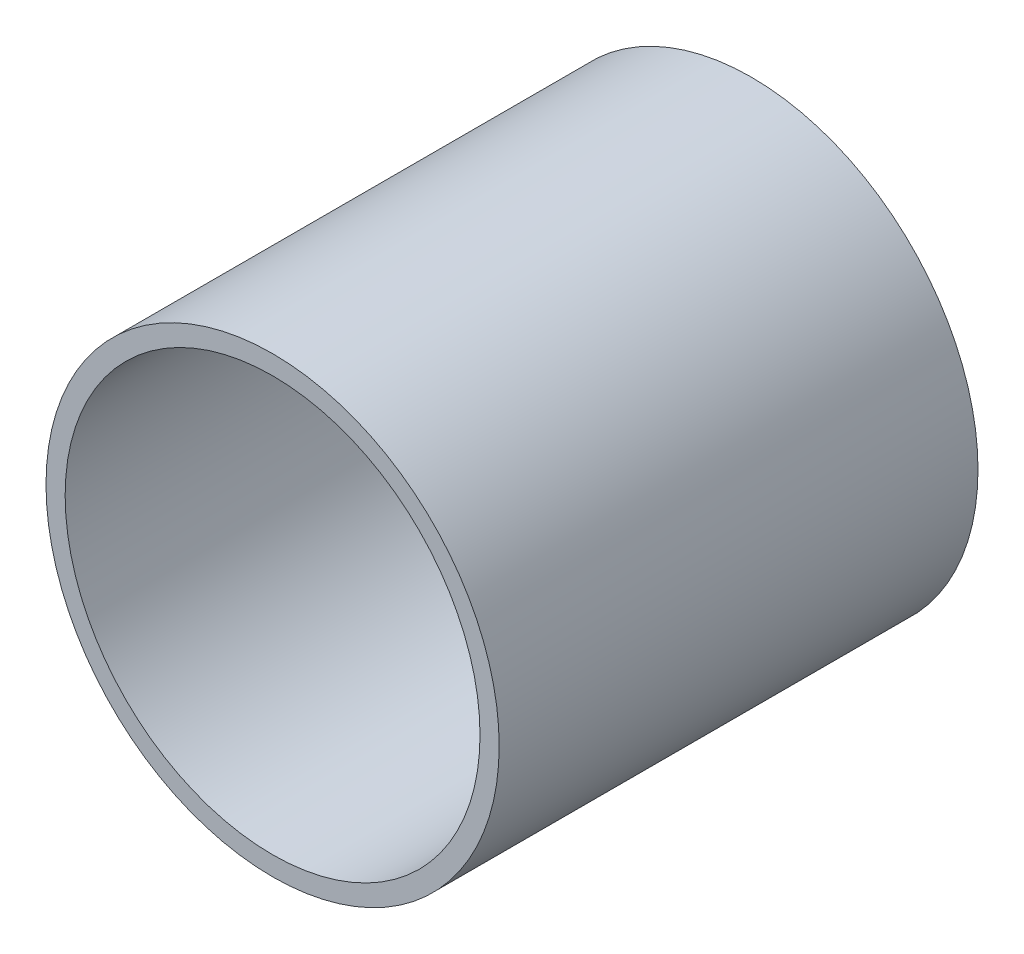
ISO-10303-21;
HEADER;
FILE_DESCRIPTION(('STEP AP214'),'2;1');
FILE_NAME('part.step','',(''),(''),'','','');
FILE_SCHEMA(('AUTOMOTIVE_DESIGN { 1 0 10303 214 1 1 1 1 }'));
ENDSEC;
DATA;
#1=APPLICATION_CONTEXT('core data for automotive mechanical design processes');
#2=APPLICATION_PROTOCOL_DEFINITION('international standard','automotive_design',2000,#1);
#3=PRODUCT_CONTEXT('',#1,'mechanical');
#4=PRODUCT('Part','Part','',(#3));
#5=PRODUCT_RELATED_PRODUCT_CATEGORY('part','',(#4));
#6=PRODUCT_DEFINITION_FORMATION('','',#4);
#7=PRODUCT_DEFINITION_CONTEXT('part definition',#1,'design');
#8=PRODUCT_DEFINITION('design','',#6,#7);
#9=PRODUCT_DEFINITION_SHAPE('','',#8);
#10=(LENGTH_UNIT() NAMED_UNIT(*) SI_UNIT(.MILLI.,.METRE.));
#11=(NAMED_UNIT(*) PLANE_ANGLE_UNIT() SI_UNIT($,.RADIAN.));
#12=(NAMED_UNIT(*) SI_UNIT($,.STERADIAN.) SOLID_ANGLE_UNIT());
#13=UNCERTAINTY_MEASURE_WITH_UNIT(LENGTH_MEASURE(1.E-05),#10,'distance_accuracy_value','');
#14=(GEOMETRIC_REPRESENTATION_CONTEXT(3) GLOBAL_UNCERTAINTY_ASSIGNED_CONTEXT((#13)) GLOBAL_UNIT_ASSIGNED_CONTEXT((#10,
#11,#12)) REPRESENTATION_CONTEXT('',''));
#15=CARTESIAN_POINT('',(0.,0.,0.));
#16=DIRECTION('',(0.,0.,1.));
#17=DIRECTION('',(1.,0.,0.));
#18=AXIS2_PLACEMENT_3D('',#15,#16,#17);
#19=CARTESIAN_POINT('',(-18.5837325396855,1.91004791513109,97.4087240167017));
#20=DIRECTION('',(0.,0.,1.));
#21=DIRECTION('',(1.,0.,0.));
#22=AXIS2_PLACEMENT_3D('',#19,#20,#21);
#23=PLANE('',#22);
#24=CARTESIAN_POINT('',(-18.5837325396855,1.91004791513109,97.4087240167017));
#25=DIRECTION('',(0.,0.,1.));
#26=DIRECTION('',(1.,0.,0.));
#27=AXIS2_PLACEMENT_3D('',#24,#25,#26);
#28=CIRCLE('',#27,84.1375);
#29=CARTESIAN_POINT('',(65.5537674603145,1.91004791513109,97.4087240167017));
#30=VERTEX_POINT('',#29);
#31=EDGE_CURVE('E10',#30,#30,#28,.T.);
#32=ORIENTED_EDGE('',*,*,#31,.T.);
#33=EDGE_LOOP('',(#32));
#34=FACE_BOUND('',#33,.T.);
#35=CARTESIAN_POINT('',(-18.5837325396855,1.91004791513109,97.4087240167017));
#36=DIRECTION('',(0.,0.,1.));
#37=DIRECTION('',(1.,0.,0.));
#38=AXIS2_PLACEMENT_3D('',#35,#36,#37);
#39=CIRCLE('',#38,77.0255);
#40=CARTESIAN_POINT('',(58.4417674603145,1.91004791513109,97.4087240167017));
#41=VERTEX_POINT('',#40);
#42=EDGE_CURVE('E41',#41,#41,#39,.T.);
#43=ORIENTED_EDGE('',*,*,#42,.F.);
#44=EDGE_LOOP('',(#43));
#45=FACE_BOUND('',#44,.T.);
#46=ADVANCED_FACE('F30',(#34,#45),#23,.T.);
#47=CARTESIAN_POINT('',(-18.5837325396855,1.91004791513109,-80.3912759832983));
#48=DIRECTION('',(0.,0.,1.));
#49=DIRECTION('',(1.,0.,0.));
#50=AXIS2_PLACEMENT_3D('',#47,#48,#49);
#51=PLANE('',#50);
#52=CARTESIAN_POINT('',(-18.5837325396855,1.91004791513109,-80.3912759832983));
#53=DIRECTION('',(0.,0.,1.));
#54=DIRECTION('',(1.,0.,0.));
#55=AXIS2_PLACEMENT_3D('',#52,#53,#54);
#56=CIRCLE('',#55,84.1375);
#57=CARTESIAN_POINT('',(65.5537674603145,1.91004791513109,-80.3912759832983));
#58=VERTEX_POINT('',#57);
#59=EDGE_CURVE('E34',#58,#58,#56,.T.);
#60=ORIENTED_EDGE('',*,*,#59,.F.);
#61=EDGE_LOOP('',(#60));
#62=FACE_BOUND('',#61,.T.);
#63=CARTESIAN_POINT('',(-18.5837325396855,1.91004791513109,-80.3912759832983));
#64=DIRECTION('',(0.,0.,1.));
#65=DIRECTION('',(1.,0.,0.));
#66=AXIS2_PLACEMENT_3D('',#63,#64,#65);
#67=CIRCLE('',#66,77.0255);
#68=CARTESIAN_POINT('',(58.4417674603145,1.91004791513109,-80.3912759832983));
#69=VERTEX_POINT('',#68);
#70=EDGE_CURVE('E43',#69,#69,#67,.T.);
#71=ORIENTED_EDGE('',*,*,#70,.T.);
#72=EDGE_LOOP('',(#71));
#73=FACE_BOUND('',#72,.T.);
#74=ADVANCED_FACE('F53',(#62,#73),#51,.F.);
#75=CARTESIAN_POINT('',(-18.5837325396855,1.91004791513109,97.4087240167017));
#76=DIRECTION('',(0.,0.,-1.));
#77=DIRECTION('',(-1.,0.,0.));
#78=AXIS2_PLACEMENT_3D('',#75,#76,#77);
#79=CYLINDRICAL_SURFACE('',#78,84.1375);
#80=ORIENTED_EDGE('',*,*,#31,.F.);
#81=EDGE_LOOP('',(#80));
#82=FACE_BOUND('',#81,.T.);
#83=ORIENTED_EDGE('',*,*,#59,.T.);
#84=EDGE_LOOP('',(#83));
#85=FACE_BOUND('',#84,.T.);
#86=ADVANCED_FACE('F32',(#82,#85),#79,.T.);
#87=CARTESIAN_POINT('',(-18.5837325396855,1.91004791513109,97.4087240167017));
#88=DIRECTION('',(0.,0.,-1.));
#89=DIRECTION('',(-1.,0.,0.));
#90=AXIS2_PLACEMENT_3D('',#87,#88,#89);
#91=CYLINDRICAL_SURFACE('',#90,77.0255);
#92=ORIENTED_EDGE('',*,*,#42,.T.);
#93=EDGE_LOOP('',(#92));
#94=FACE_BOUND('',#93,.T.);
#95=ORIENTED_EDGE('',*,*,#70,.F.);
#96=EDGE_LOOP('',(#95));
#97=FACE_BOUND('',#96,.T.);
#98=ADVANCED_FACE('F49',(#94,#97),#91,.F.);
#99=CLOSED_SHELL('',(#46,#74,#86,#98));
#100=MANIFOLD_SOLID_BREP('B2',#99);
#101=ADVANCED_BREP_SHAPE_REPRESENTATION('',(#18,#100),#14);
#102=SHAPE_DEFINITION_REPRESENTATION(#9,#101);
ENDSEC;
END-ISO-10303-21;
